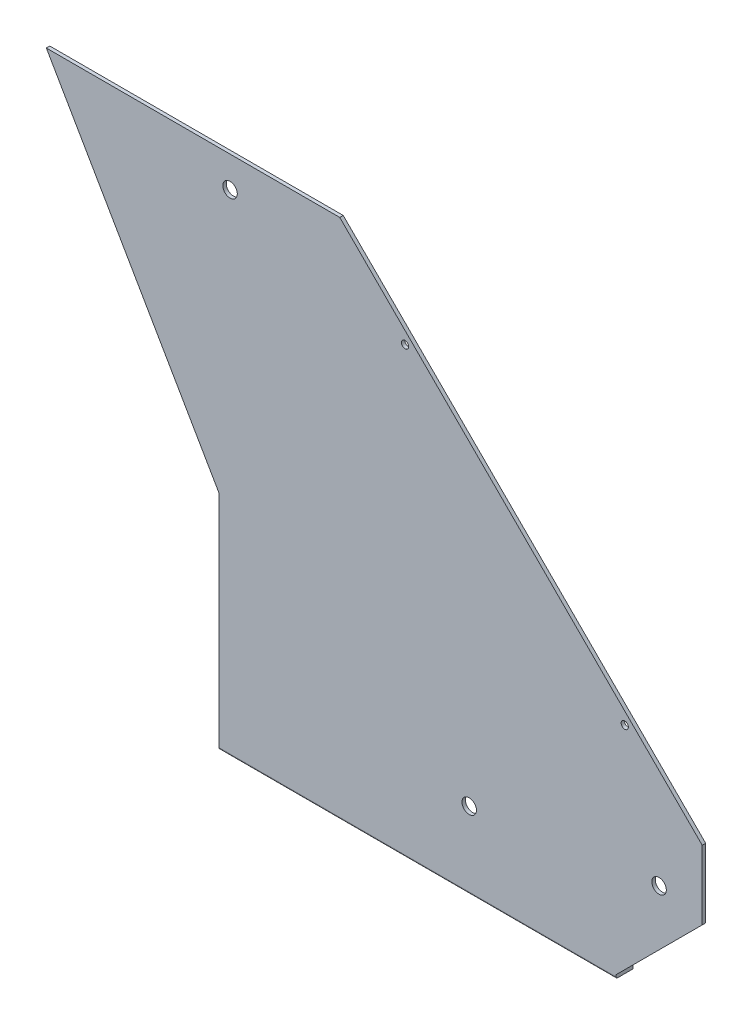
ISO-10303-21;
HEADER;
FILE_DESCRIPTION(('STEP AP214'),'2;1');
FILE_NAME('part.step','',(''),(''),'','','');
FILE_SCHEMA(('AUTOMOTIVE_DESIGN { 1 0 10303 214 1 1 1 1 }'));
ENDSEC;
DATA;
#1=APPLICATION_CONTEXT('core data for automotive mechanical design processes');
#2=APPLICATION_PROTOCOL_DEFINITION('international standard','automotive_design',2000,#1);
#3=PRODUCT_CONTEXT('',#1,'mechanical');
#4=PRODUCT('Part','Part','',(#3));
#5=PRODUCT_RELATED_PRODUCT_CATEGORY('part','',(#4));
#6=PRODUCT_DEFINITION_FORMATION('','',#4);
#7=PRODUCT_DEFINITION_CONTEXT('part definition',#1,'design');
#8=PRODUCT_DEFINITION('design','',#6,#7);
#9=PRODUCT_DEFINITION_SHAPE('','',#8);
#10=(LENGTH_UNIT() NAMED_UNIT(*) SI_UNIT(.MILLI.,.METRE.));
#11=(NAMED_UNIT(*) PLANE_ANGLE_UNIT() SI_UNIT($,.RADIAN.));
#12=(NAMED_UNIT(*) SI_UNIT($,.STERADIAN.) SOLID_ANGLE_UNIT());
#13=UNCERTAINTY_MEASURE_WITH_UNIT(LENGTH_MEASURE(1.E-05),#10,'distance_accuracy_value','');
#14=(GEOMETRIC_REPRESENTATION_CONTEXT(3) GLOBAL_UNCERTAINTY_ASSIGNED_CONTEXT((#13)) GLOBAL_UNIT_ASSIGNED_CONTEXT((#10,
#11,#12)) REPRESENTATION_CONTEXT('',''));
#15=CARTESIAN_POINT('',(0.,0.,0.));
#16=DIRECTION('',(0.,0.,1.));
#17=DIRECTION('',(1.,0.,0.));
#18=AXIS2_PLACEMENT_3D('',#15,#16,#17);
#19=CARTESIAN_POINT('',(0.,150.,-122.));
#20=DIRECTION('',(0.,-1.,0.));
#21=DIRECTION('',(0.,0.,1.));
#22=AXIS2_PLACEMENT_3D('',#19,#20,#21);
#23=PLANE('',#22);
#24=DIRECTION('',(-1.,0.,0.));
#25=VECTOR('',#24,1.);
#26=CARTESIAN_POINT('',(0.,150.,-120.));
#27=LINE('',#26,#25);
#28=CARTESIAN_POINT('',(-70.,150.,-120.));
#29=VERTEX_POINT('',#28);
#30=CARTESIAN_POINT('',(-240.,150.,-120.));
#31=VERTEX_POINT('',#30);
#32=EDGE_CURVE('E175',#29,#31,#27,.T.);
#33=ORIENTED_EDGE('',*,*,#32,.F.);
#34=DIRECTION('',(0.,0.,1.));
#35=VECTOR('',#34,1.);
#36=CARTESIAN_POINT('',(-70.,150.,-122.));
#37=LINE('',#36,#35);
#38=CARTESIAN_POINT('',(-70.,150.,-122.));
#39=VERTEX_POINT('',#38);
#40=EDGE_CURVE('E174',#39,#29,#37,.T.);
#41=ORIENTED_EDGE('',*,*,#40,.F.);
#42=DIRECTION('',(-1.,0.,0.));
#43=VECTOR('',#42,1.);
#44=CARTESIAN_POINT('',(0.,150.,-122.));
#45=LINE('',#44,#43);
#46=CARTESIAN_POINT('',(-240.,150.,-122.));
#47=VERTEX_POINT('',#46);
#48=EDGE_CURVE('E161',#39,#47,#45,.T.);
#49=ORIENTED_EDGE('',*,*,#48,.T.);
#50=DIRECTION('',(0.,0.,1.));
#51=VECTOR('',#50,1.);
#52=CARTESIAN_POINT('',(-240.,150.,-122.));
#53=LINE('',#52,#51);
#54=EDGE_CURVE('E202',#47,#31,#53,.T.);
#55=ORIENTED_EDGE('',*,*,#54,.T.);
#56=EDGE_LOOP('',(#33,#41,#49,#55));
#57=FACE_BOUND('',#56,.T.);
#58=ADVANCED_FACE('F37',(#57),#23,.F.);
#59=CARTESIAN_POINT('',(-115.048094716168,-66.4230484541327,-122.));
#60=DIRECTION('',(0.86602540378444,0.499999999999998,0.));
#61=DIRECTION('',(-0.499999999999998,0.86602540378444,0.));
#62=AXIS2_PLACEMENT_3D('',#59,#60,#61);
#63=PLANE('',#62);
#64=DIRECTION('',(0.499999999999998,-0.86602540378444,0.));
#65=VECTOR('',#64,1.);
#66=CARTESIAN_POINT('',(-115.048094716168,-66.4230484541327,-120.));
#67=LINE('',#66,#65);
#68=CARTESIAN_POINT('',(-140.,-23.2050807568887,-120.));
#69=VERTEX_POINT('',#68);
#70=EDGE_CURVE('E178',#31,#69,#67,.T.);
#71=ORIENTED_EDGE('',*,*,#70,.F.);
#72=ORIENTED_EDGE('',*,*,#54,.F.);
#73=DIRECTION('',(0.499999999999998,-0.86602540378444,0.));
#74=VECTOR('',#73,1.);
#75=CARTESIAN_POINT('',(-115.048094716168,-66.4230484541327,-122.));
#76=LINE('',#75,#74);
#77=CARTESIAN_POINT('',(-140.,-23.2050807568887,-122.));
#78=VERTEX_POINT('',#77);
#79=EDGE_CURVE('E164',#47,#78,#76,.T.);
#80=ORIENTED_EDGE('',*,*,#79,.T.);
#81=DIRECTION('',(0.,0.,1.));
#82=VECTOR('',#81,1.);
#83=CARTESIAN_POINT('',(-140.,-23.2050807568887,-122.));
#84=LINE('',#83,#82);
#85=EDGE_CURVE('E199',#78,#69,#84,.T.);
#86=ORIENTED_EDGE('',*,*,#85,.T.);
#87=EDGE_LOOP('',(#71,#72,#80,#86));
#88=FACE_BOUND('',#87,.T.);
#89=ADVANCED_FACE('F254',(#88),#63,.F.);
#90=CARTESIAN_POINT('',(-140.,0.,-122.));
#91=DIRECTION('',(1.,0.,0.));
#92=DIRECTION('',(0.,1.,0.));
#93=AXIS2_PLACEMENT_3D('',#90,#91,#92);
#94=PLANE('',#93);
#95=DIRECTION('',(0.,-1.,0.));
#96=VECTOR('',#95,1.);
#97=CARTESIAN_POINT('',(-140.,0.,-120.));
#98=LINE('',#97,#96);
#99=CARTESIAN_POINT('',(-140.,-151.,-120.));
#100=VERTEX_POINT('',#99);
#101=EDGE_CURVE('E181',#69,#100,#98,.T.);
#102=ORIENTED_EDGE('',*,*,#101,.F.);
#103=ORIENTED_EDGE('',*,*,#85,.F.);
#104=DIRECTION('',(0.,-1.,0.));
#105=VECTOR('',#104,1.);
#106=CARTESIAN_POINT('',(-140.,0.,-122.));
#107=LINE('',#106,#105);
#108=CARTESIAN_POINT('',(-140.,-149.,-122.));
#109=VERTEX_POINT('',#108);
#110=EDGE_CURVE('E168',#78,#109,#107,.T.);
#111=ORIENTED_EDGE('',*,*,#110,.T.);
#112=CARTESIAN_POINT('',(-140.,-149.,-123.));
#113=DIRECTION('',(-1.,0.,0.));
#114=DIRECTION('',(0.,1.,0.));
#115=AXIS2_PLACEMENT_3D('',#112,#113,#114);
#116=CIRCLE('',#115,1.);
#117=CARTESIAN_POINT('',(-140.,-150.,-123.));
#118=VERTEX_POINT('',#117);
#119=EDGE_CURVE('E11',#118,#109,#116,.T.);
#120=ORIENTED_EDGE('',*,*,#119,.F.);
#121=DIRECTION('',(0.,0.,1.));
#122=VECTOR('',#121,1.);
#123=CARTESIAN_POINT('',(-140.,-150.,-120.));
#124=LINE('',#123,#122);
#125=CARTESIAN_POINT('',(-140.,-150.,-130.));
#126=VERTEX_POINT('',#125);
#127=EDGE_CURVE('E156',#126,#118,#124,.T.);
#128=ORIENTED_EDGE('',*,*,#127,.F.);
#129=DIRECTION('',(0.,1.,0.));
#130=VECTOR('',#129,1.);
#131=CARTESIAN_POINT('',(-140.,-152.,-130.));
#132=LINE('',#131,#130);
#133=CARTESIAN_POINT('',(-140.,-152.,-130.));
#134=VERTEX_POINT('',#133);
#135=EDGE_CURVE('E134',#134,#126,#132,.T.);
#136=ORIENTED_EDGE('',*,*,#135,.F.);
#137=DIRECTION('',(0.,0.,1.));
#138=VECTOR('',#137,1.);
#139=CARTESIAN_POINT('',(-140.,-152.,-120.));
#140=LINE('',#139,#138);
#141=CARTESIAN_POINT('',(-140.,-152.,-121.));
#142=VERTEX_POINT('',#141);
#143=EDGE_CURVE('E130',#134,#142,#140,.T.);
#144=ORIENTED_EDGE('',*,*,#143,.T.);
#145=CARTESIAN_POINT('',(-140.,-151.,-121.));
#146=DIRECTION('',(-1.,0.,0.));
#147=DIRECTION('',(0.,1.,0.));
#148=AXIS2_PLACEMENT_3D('',#145,#146,#147);
#149=CIRCLE('',#148,1.);
#150=EDGE_CURVE('E222',#100,#142,#149,.F.);
#151=ORIENTED_EDGE('',*,*,#150,.F.);
#152=EDGE_LOOP('',(#102,#103,#111,#120,#128,#136,#144,#151));
#153=FACE_BOUND('',#152,.T.);
#154=ADVANCED_FACE('F237',(#153),#94,.F.);
#155=CARTESIAN_POINT('',(120.,-120.,-122.));
#156=DIRECTION('',(0.707106781186547,-0.707106781186547,0.));
#157=DIRECTION('',(0.707106781186548,0.707106781186548,0.));
#158=AXIS2_PLACEMENT_3D('',#155,#156,#157);
#159=PLANE('',#158);
#160=DIRECTION('',(-0.707106781186548,-0.707106781186548,0.));
#161=VECTOR('',#160,1.);
#162=CARTESIAN_POINT('',(120.,-120.,-120.));
#163=LINE('',#162,#161);
#164=CARTESIAN_POINT('',(140.,-100.,-120.));
#165=VERTEX_POINT('',#164);
#166=CARTESIAN_POINT('',(90.0000000000001,-150.,-120.));
#167=VERTEX_POINT('',#166);
#168=EDGE_CURVE('E184',#165,#167,#163,.T.);
#169=ORIENTED_EDGE('',*,*,#168,.T.);
#170=DIRECTION('',(0.,0.,1.));
#171=VECTOR('',#170,1.);
#172=CARTESIAN_POINT('',(90.0000000000001,-150.,-122.));
#173=LINE('',#172,#171);
#174=CARTESIAN_POINT('',(90.0000000000001,-150.,-123.));
#175=VERTEX_POINT('',#174);
#176=EDGE_CURVE('E198',#175,#167,#173,.T.);
#177=ORIENTED_EDGE('',*,*,#176,.F.);
#178=CARTESIAN_POINT('',(91.0000000000001,-149.,-123.));
#179=DIRECTION('',(-0.707106781186547,0.707106781186547,0.));
#180=DIRECTION('',(-0.707106781186548,-0.707106781186548,0.));
#181=AXIS2_PLACEMENT_3D('',#178,#179,#180);
#182=ELLIPSE('',#181,1.4142135623731,1.);
#183=CARTESIAN_POINT('',(91.0000000000001,-149.,-122.));
#184=VERTEX_POINT('',#183);
#185=EDGE_CURVE('E45',#184,#175,#182,.F.);
#186=ORIENTED_EDGE('',*,*,#185,.F.);
#187=DIRECTION('',(-0.707106781186548,-0.707106781186548,0.));
#188=VECTOR('',#187,1.);
#189=CARTESIAN_POINT('',(120.,-120.,-122.));
#190=LINE('',#189,#188);
#191=CARTESIAN_POINT('',(140.,-100.,-122.));
#192=VERTEX_POINT('',#191);
#193=EDGE_CURVE('E172',#192,#184,#190,.T.);
#194=ORIENTED_EDGE('',*,*,#193,.F.);
#195=DIRECTION('',(0.,0.,1.));
#196=VECTOR('',#195,1.);
#197=CARTESIAN_POINT('',(140.,-100.,-122.));
#198=LINE('',#197,#196);
#199=EDGE_CURVE('E195',#192,#165,#198,.T.);
#200=ORIENTED_EDGE('',*,*,#199,.T.);
#201=EDGE_LOOP('',(#169,#177,#186,#194,#200));
#202=FACE_BOUND('',#201,.T.);
#203=ADVANCED_FACE('F230',(#202),#159,.T.);
#204=CARTESIAN_POINT('',(140.,0.,-122.));
#205=DIRECTION('',(1.,0.,0.));
#206=DIRECTION('',(0.,1.,0.));
#207=AXIS2_PLACEMENT_3D('',#204,#205,#206);
#208=PLANE('',#207);
#209=DIRECTION('',(0.,-1.,0.));
#210=VECTOR('',#209,1.);
#211=CARTESIAN_POINT('',(140.,0.,-120.));
#212=LINE('',#211,#210);
#213=CARTESIAN_POINT('',(140.,-60.0000000000008,-120.));
#214=VERTEX_POINT('',#213);
#215=EDGE_CURVE('E187',#214,#165,#212,.T.);
#216=ORIENTED_EDGE('',*,*,#215,.T.);
#217=ORIENTED_EDGE('',*,*,#199,.F.);
#218=DIRECTION('',(0.,-1.,0.));
#219=VECTOR('',#218,1.);
#220=CARTESIAN_POINT('',(140.,0.,-122.));
#221=LINE('',#220,#219);
#222=CARTESIAN_POINT('',(140.,-60.0000000000008,-122.));
#223=VERTEX_POINT('',#222);
#224=EDGE_CURVE('E169',#223,#192,#221,.T.);
#225=ORIENTED_EDGE('',*,*,#224,.F.);
#226=DIRECTION('',(0.,0.,1.));
#227=VECTOR('',#226,1.);
#228=CARTESIAN_POINT('',(140.,-60.0000000000008,-122.));
#229=LINE('',#228,#227);
#230=EDGE_CURVE('E192',#223,#214,#229,.T.);
#231=ORIENTED_EDGE('',*,*,#230,.T.);
#232=EDGE_LOOP('',(#216,#217,#225,#231));
#233=FACE_BOUND('',#232,.T.);
#234=ADVANCED_FACE('F261',(#233),#208,.T.);
#235=CARTESIAN_POINT('',(39.9999999999999,39.9999999999998,-122.));
#236=DIRECTION('',(0.707106781186549,0.707106781186546,0.));
#237=DIRECTION('',(-0.707106781186546,0.707106781186549,0.));
#238=AXIS2_PLACEMENT_3D('',#235,#236,#237);
#239=PLANE('',#238);
#240=DIRECTION('',(0.707106781186546,-0.707106781186549,0.));
#241=VECTOR('',#240,1.);
#242=CARTESIAN_POINT('',(39.9999999999999,39.9999999999998,-120.));
#243=LINE('',#242,#241);
#244=EDGE_CURVE('E165',#29,#214,#243,.T.);
#245=ORIENTED_EDGE('',*,*,#244,.T.);
#246=ORIENTED_EDGE('',*,*,#230,.F.);
#247=DIRECTION('',(0.707106781186546,-0.707106781186549,0.));
#248=VECTOR('',#247,1.);
#249=CARTESIAN_POINT('',(39.9999999999999,39.9999999999998,-122.));
#250=LINE('',#249,#248);
#251=EDGE_CURVE('E171',#39,#223,#250,.T.);
#252=ORIENTED_EDGE('',*,*,#251,.F.);
#253=ORIENTED_EDGE('',*,*,#40,.T.);
#254=EDGE_LOOP('',(#245,#246,#252,#253));
#255=FACE_BOUND('',#254,.T.);
#256=ADVANCED_FACE('F260',(#255),#239,.T.);
#257=CARTESIAN_POINT('',(0.,0.,-122.));
#258=DIRECTION('',(0.,0.,-1.));
#259=DIRECTION('',(1.,0.,0.));
#260=AXIS2_PLACEMENT_3D('',#257,#258,#259);
#261=PLANE('',#260);
#262=CARTESIAN_POINT('',(-32.1751442127218,105.104076400856,-122.));
#263=DIRECTION('',(0.,0.,1.));
#264=DIRECTION('',(1.,0.,0.));
#265=AXIS2_PLACEMENT_3D('',#262,#263,#264);
#266=CIRCLE('',#265,2.1);
#267=CARTESIAN_POINT('',(-30.0751442127218,105.104076400856,-122.));
#268=VERTEX_POINT('',#267);
#269=EDGE_CURVE('E353',#268,#268,#266,.T.);
#270=ORIENTED_EDGE('',*,*,#269,.T.);
#271=EDGE_LOOP('',(#270));
#272=FACE_BOUND('',#271,.T.);
#273=CARTESIAN_POINT('',(95.1040764008565,-22.1751442127225,-122.));
#274=DIRECTION('',(0.,0.,1.));
#275=DIRECTION('',(1.,0.,0.));
#276=AXIS2_PLACEMENT_3D('',#273,#274,#275);
#277=CIRCLE('',#276,2.1);
#278=CARTESIAN_POINT('',(97.2040764008565,-22.1751442127225,-122.));
#279=VERTEX_POINT('',#278);
#280=EDGE_CURVE('E349',#279,#279,#277,.T.);
#281=ORIENTED_EDGE('',*,*,#280,.T.);
#282=EDGE_LOOP('',(#281));
#283=FACE_BOUND('',#282,.T.);
#284=CARTESIAN_POINT('',(115.,-92.89246887,-122.));
#285=DIRECTION('',(0.,0.,1.));
#286=DIRECTION('',(1.,0.,0.));
#287=AXIS2_PLACEMENT_3D('',#284,#285,#286);
#288=CIRCLE('',#287,4.19999999999999);
#289=CARTESIAN_POINT('',(119.2,-92.89246887,-122.));
#290=VERTEX_POINT('',#289);
#291=EDGE_CURVE('E333',#290,#290,#288,.T.);
#292=ORIENTED_EDGE('',*,*,#291,.T.);
#293=EDGE_LOOP('',(#292));
#294=FACE_BOUND('',#293,.T.);
#295=CARTESIAN_POINT('',(4.99999999999995,-107.89246887,-122.));
#296=DIRECTION('',(0.,0.,1.));
#297=DIRECTION('',(1.,0.,0.));
#298=AXIS2_PLACEMENT_3D('',#295,#296,#297);
#299=CIRCLE('',#298,4.2);
#300=CARTESIAN_POINT('',(9.19999999999995,-107.89246887,-122.));
#301=VERTEX_POINT('',#300);
#302=EDGE_CURVE('E329',#301,#301,#299,.T.);
#303=ORIENTED_EDGE('',*,*,#302,.T.);
#304=EDGE_LOOP('',(#303));
#305=FACE_BOUND('',#304,.T.);
#306=CARTESIAN_POINT('',(-133.564064605509,132.10753113,-122.));
#307=DIRECTION('',(0.,0.,1.));
#308=DIRECTION('',(1.,0.,0.));
#309=AXIS2_PLACEMENT_3D('',#306,#307,#308);
#310=CIRCLE('',#309,4.20000000000001);
#311=CARTESIAN_POINT('',(-129.364064605509,132.10753113,-122.));
#312=VERTEX_POINT('',#311);
#313=EDGE_CURVE('E325',#312,#312,#310,.T.);
#314=ORIENTED_EDGE('',*,*,#313,.T.);
#315=EDGE_LOOP('',(#314));
#316=FACE_BOUND('',#315,.T.);
#317=ORIENTED_EDGE('',*,*,#110,.F.);
#318=ORIENTED_EDGE('',*,*,#79,.F.);
#319=ORIENTED_EDGE('',*,*,#48,.F.);
#320=ORIENTED_EDGE('',*,*,#251,.T.);
#321=ORIENTED_EDGE('',*,*,#224,.T.);
#322=ORIENTED_EDGE('',*,*,#193,.T.);
#323=DIRECTION('',(1.,0.,0.));
#324=VECTOR('',#323,1.);
#325=CARTESIAN_POINT('',(90.0000000000001,-149.,-122.));
#326=LINE('',#325,#324);
#327=EDGE_CURVE('E59',#109,#184,#326,.T.);
#328=ORIENTED_EDGE('',*,*,#327,.F.);
#329=EDGE_LOOP('',(#317,#318,#319,#320,#321,#322,#328));
#330=FACE_BOUND('',#329,.T.);
#331=ADVANCED_FACE('F240',(#272,#283,#294,#305,#316,#330),#261,.T.);
#332=CARTESIAN_POINT('',(0.,0.,-120.));
#333=DIRECTION('',(0.,0.,-1.));
#334=DIRECTION('',(1.,0.,0.));
#335=AXIS2_PLACEMENT_3D('',#332,#333,#334);
#336=PLANE('',#335);
#337=CARTESIAN_POINT('',(-32.1751442127218,105.104076400856,-120.));
#338=DIRECTION('',(0.,0.,1.));
#339=DIRECTION('',(1.,0.,0.));
#340=AXIS2_PLACEMENT_3D('',#337,#338,#339);
#341=CIRCLE('',#340,2.1);
#342=CARTESIAN_POINT('',(-30.0751442127218,105.104076400856,-120.));
#343=VERTEX_POINT('',#342);
#344=EDGE_CURVE('E309',#343,#343,#341,.T.);
#345=ORIENTED_EDGE('',*,*,#344,.F.);
#346=EDGE_LOOP('',(#345));
#347=FACE_BOUND('',#346,.T.);
#348=CARTESIAN_POINT('',(95.1040764008565,-22.1751442127225,-120.));
#349=DIRECTION('',(0.,0.,1.));
#350=DIRECTION('',(1.,0.,0.));
#351=AXIS2_PLACEMENT_3D('',#348,#349,#350);
#352=CIRCLE('',#351,2.1);
#353=CARTESIAN_POINT('',(97.2040764008565,-22.1751442127225,-120.));
#354=VERTEX_POINT('',#353);
#355=EDGE_CURVE('E313',#354,#354,#352,.T.);
#356=ORIENTED_EDGE('',*,*,#355,.F.);
#357=EDGE_LOOP('',(#356));
#358=FACE_BOUND('',#357,.T.);
#359=CARTESIAN_POINT('',(115.,-92.89246887,-120.));
#360=DIRECTION('',(0.,0.,1.));
#361=DIRECTION('',(1.,0.,0.));
#362=AXIS2_PLACEMENT_3D('',#359,#360,#361);
#363=CIRCLE('',#362,4.19999999999999);
#364=CARTESIAN_POINT('',(119.2,-92.89246887,-120.));
#365=VERTEX_POINT('',#364);
#366=EDGE_CURVE('E317',#365,#365,#363,.T.);
#367=ORIENTED_EDGE('',*,*,#366,.F.);
#368=EDGE_LOOP('',(#367));
#369=FACE_BOUND('',#368,.T.);
#370=CARTESIAN_POINT('',(4.99999999999995,-107.89246887,-120.));
#371=DIRECTION('',(0.,0.,1.));
#372=DIRECTION('',(1.,0.,0.));
#373=AXIS2_PLACEMENT_3D('',#370,#371,#372);
#374=CIRCLE('',#373,4.2);
#375=CARTESIAN_POINT('',(9.19999999999995,-107.89246887,-120.));
#376=VERTEX_POINT('',#375);
#377=EDGE_CURVE('E321',#376,#376,#374,.T.);
#378=ORIENTED_EDGE('',*,*,#377,.F.);
#379=EDGE_LOOP('',(#378));
#380=FACE_BOUND('',#379,.T.);
#381=CARTESIAN_POINT('',(-133.564064605509,132.10753113,-120.));
#382=DIRECTION('',(0.,0.,1.));
#383=DIRECTION('',(1.,0.,0.));
#384=AXIS2_PLACEMENT_3D('',#381,#382,#383);
#385=CIRCLE('',#384,4.20000000000001);
#386=CARTESIAN_POINT('',(-129.364064605509,132.10753113,-120.));
#387=VERTEX_POINT('',#386);
#388=EDGE_CURVE('E160',#387,#387,#385,.T.);
#389=ORIENTED_EDGE('',*,*,#388,.F.);
#390=EDGE_LOOP('',(#389));
#391=FACE_BOUND('',#390,.T.);
#392=DIRECTION('',(0.,1.,0.));
#393=VECTOR('',#392,1.);
#394=CARTESIAN_POINT('',(90.0000000000001,-152.,-120.));
#395=LINE('',#394,#393);
#396=CARTESIAN_POINT('',(90.0000000000001,-151.,-120.));
#397=VERTEX_POINT('',#396);
#398=EDGE_CURVE('E141',#397,#167,#395,.T.);
#399=ORIENTED_EDGE('',*,*,#398,.T.);
#400=ORIENTED_EDGE('',*,*,#168,.F.);
#401=ORIENTED_EDGE('',*,*,#215,.F.);
#402=ORIENTED_EDGE('',*,*,#244,.F.);
#403=ORIENTED_EDGE('',*,*,#32,.T.);
#404=ORIENTED_EDGE('',*,*,#70,.T.);
#405=ORIENTED_EDGE('',*,*,#101,.T.);
#406=DIRECTION('',(1.,0.,0.));
#407=VECTOR('',#406,1.);
#408=CARTESIAN_POINT('',(0.,-151.,-120.));
#409=LINE('',#408,#407);
#410=EDGE_CURVE('E220',#397,#100,#409,.F.);
#411=ORIENTED_EDGE('',*,*,#410,.F.);
#412=EDGE_LOOP('',(#399,#400,#401,#402,#403,#404,#405,#411));
#413=FACE_BOUND('',#412,.T.);
#414=ADVANCED_FACE('F248',(#347,#358,#369,#380,#391,#413),#336,.F.);
#415=CARTESIAN_POINT('',(0.,-150.,-120.));
#416=DIRECTION('',(0.,1.,0.));
#417=DIRECTION('',(0.,0.,-1.));
#418=AXIS2_PLACEMENT_3D('',#415,#416,#417);
#419=PLANE('',#418);
#420=CARTESIAN_POINT('',(-120.,-150.,-126.));
#421=DIRECTION('',(0.,-1.,0.));
#422=DIRECTION('',(0.,0.,-1.));
#423=AXIS2_PLACEMENT_3D('',#420,#421,#422);
#424=CIRCLE('',#423,2.1);
#425=CARTESIAN_POINT('',(-120.,-150.,-128.1));
#426=VERTEX_POINT('',#425);
#427=EDGE_CURVE('E344',#426,#426,#424,.T.);
#428=ORIENTED_EDGE('',*,*,#427,.T.);
#429=EDGE_LOOP('',(#428));
#430=FACE_BOUND('',#429,.T.);
#431=CARTESIAN_POINT('',(10.0000000000001,-150.,-126.));
#432=DIRECTION('',(0.,-1.,0.));
#433=DIRECTION('',(0.,0.,-1.));
#434=AXIS2_PLACEMENT_3D('',#431,#432,#433);
#435=CIRCLE('',#434,2.1);
#436=CARTESIAN_POINT('',(10.0000000000001,-150.,-128.1));
#437=VERTEX_POINT('',#436);
#438=EDGE_CURVE('E338',#437,#437,#435,.T.);
#439=ORIENTED_EDGE('',*,*,#438,.T.);
#440=EDGE_LOOP('',(#439));
#441=FACE_BOUND('',#440,.T.);
#442=DIRECTION('',(0.,0.,-1.));
#443=VECTOR('',#442,1.);
#444=CARTESIAN_POINT('',(90.0000000000001,-150.,-120.));
#445=LINE('',#444,#443);
#446=CARTESIAN_POINT('',(90.0000000000001,-150.,-130.));
#447=VERTEX_POINT('',#446);
#448=EDGE_CURVE('E159',#175,#447,#445,.T.);
#449=ORIENTED_EDGE('',*,*,#448,.T.);
#450=DIRECTION('',(-1.,0.,0.));
#451=VECTOR('',#450,1.);
#452=CARTESIAN_POINT('',(-140.,-150.,-130.));
#453=LINE('',#452,#451);
#454=EDGE_CURVE('E139',#447,#126,#453,.T.);
#455=ORIENTED_EDGE('',*,*,#454,.T.);
#456=ORIENTED_EDGE('',*,*,#127,.T.);
#457=DIRECTION('',(1.,0.,0.));
#458=VECTOR('',#457,1.);
#459=CARTESIAN_POINT('',(-140.,-150.,-123.));
#460=LINE('',#459,#458);
#461=EDGE_CURVE('E52',#175,#118,#460,.F.);
#462=ORIENTED_EDGE('',*,*,#461,.F.);
#463=EDGE_LOOP('',(#449,#455,#456,#462));
#464=FACE_BOUND('',#463,.T.);
#465=ADVANCED_FACE('F232',(#430,#441,#464),#419,.T.);
#466=CARTESIAN_POINT('',(90.0000000000001,-152.,-120.));
#467=DIRECTION('',(-1.,0.,0.));
#468=DIRECTION('',(0.,0.,-1.));
#469=AXIS2_PLACEMENT_3D('',#466,#467,#468);
#470=PLANE('',#469);
#471=DIRECTION('',(0.,0.,-1.));
#472=VECTOR('',#471,1.);
#473=CARTESIAN_POINT('',(90.0000000000001,-152.,-120.));
#474=LINE('',#473,#472);
#475=CARTESIAN_POINT('',(90.0000000000001,-152.,-121.));
#476=VERTEX_POINT('',#475);
#477=CARTESIAN_POINT('',(90.0000000000001,-152.,-130.));
#478=VERTEX_POINT('',#477);
#479=EDGE_CURVE('E128',#476,#478,#474,.T.);
#480=ORIENTED_EDGE('',*,*,#479,.T.);
#481=DIRECTION('',(0.,1.,0.));
#482=VECTOR('',#481,1.);
#483=CARTESIAN_POINT('',(90.0000000000001,-152.,-130.));
#484=LINE('',#483,#482);
#485=EDGE_CURVE('E137',#478,#447,#484,.T.);
#486=ORIENTED_EDGE('',*,*,#485,.T.);
#487=ORIENTED_EDGE('',*,*,#448,.F.);
#488=ORIENTED_EDGE('',*,*,#176,.T.);
#489=ORIENTED_EDGE('',*,*,#398,.F.);
#490=CARTESIAN_POINT('',(90.0000000000001,-151.,-121.));
#491=DIRECTION('',(1.,0.,0.));
#492=DIRECTION('',(0.,0.,-1.));
#493=AXIS2_PLACEMENT_3D('',#490,#491,#492);
#494=CIRCLE('',#493,1.);
#495=EDGE_CURVE('E146',#476,#397,#494,.F.);
#496=ORIENTED_EDGE('',*,*,#495,.F.);
#497=EDGE_LOOP('',(#480,#486,#487,#488,#489,#496));
#498=FACE_BOUND('',#497,.T.);
#499=ADVANCED_FACE('F144',(#498),#470,.F.);
#500=CARTESIAN_POINT('',(-140.,-152.,-130.));
#501=DIRECTION('',(0.,0.,1.));
#502=DIRECTION('',(-1.,0.,0.));
#503=AXIS2_PLACEMENT_3D('',#500,#501,#502);
#504=PLANE('',#503);
#505=ORIENTED_EDGE('',*,*,#454,.F.);
#506=ORIENTED_EDGE('',*,*,#485,.F.);
#507=DIRECTION('',(-1.,0.,0.));
#508=VECTOR('',#507,1.);
#509=CARTESIAN_POINT('',(-140.,-152.,-130.));
#510=LINE('',#509,#508);
#511=EDGE_CURVE('E124',#478,#134,#510,.T.);
#512=ORIENTED_EDGE('',*,*,#511,.T.);
#513=ORIENTED_EDGE('',*,*,#135,.T.);
#514=EDGE_LOOP('',(#505,#506,#512,#513));
#515=FACE_BOUND('',#514,.T.);
#516=ADVANCED_FACE('F138',(#515),#504,.F.);
#517=CARTESIAN_POINT('',(0.,-152.,-120.));
#518=DIRECTION('',(0.,1.,0.));
#519=DIRECTION('',(0.,0.,-1.));
#520=AXIS2_PLACEMENT_3D('',#517,#518,#519);
#521=PLANE('',#520);
#522=CARTESIAN_POINT('',(-120.,-152.,-126.));
#523=DIRECTION('',(0.,-1.,0.));
#524=DIRECTION('',(0.,0.,-1.));
#525=AXIS2_PLACEMENT_3D('',#522,#523,#524);
#526=CIRCLE('',#525,2.1);
#527=CARTESIAN_POINT('',(-120.,-152.,-128.1));
#528=VERTEX_POINT('',#527);
#529=EDGE_CURVE('E341',#528,#528,#526,.T.);
#530=ORIENTED_EDGE('',*,*,#529,.F.);
#531=EDGE_LOOP('',(#530));
#532=FACE_BOUND('',#531,.T.);
#533=CARTESIAN_POINT('',(10.0000000000001,-152.,-126.));
#534=DIRECTION('',(0.,-1.,0.));
#535=DIRECTION('',(0.,0.,-1.));
#536=AXIS2_PLACEMENT_3D('',#533,#534,#535);
#537=CIRCLE('',#536,2.1);
#538=CARTESIAN_POINT('',(10.0000000000001,-152.,-128.1));
#539=VERTEX_POINT('',#538);
#540=EDGE_CURVE('E336',#539,#539,#537,.T.);
#541=ORIENTED_EDGE('',*,*,#540,.F.);
#542=EDGE_LOOP('',(#541));
#543=FACE_BOUND('',#542,.T.);
#544=ORIENTED_EDGE('',*,*,#143,.F.);
#545=ORIENTED_EDGE('',*,*,#511,.F.);
#546=ORIENTED_EDGE('',*,*,#479,.F.);
#547=DIRECTION('',(1.,0.,0.));
#548=VECTOR('',#547,1.);
#549=CARTESIAN_POINT('',(0.,-152.,-121.));
#550=LINE('',#549,#548);
#551=EDGE_CURVE('E205',#142,#476,#550,.T.);
#552=ORIENTED_EDGE('',*,*,#551,.F.);
#553=EDGE_LOOP('',(#544,#545,#546,#552));
#554=FACE_BOUND('',#553,.T.);
#555=ADVANCED_FACE('F126',(#532,#543,#554),#521,.F.);
#556=CARTESIAN_POINT('',(0.,-151.,-121.));
#557=DIRECTION('',(1.,0.,0.));
#558=DIRECTION('',(0.,0.,1.));
#559=AXIS2_PLACEMENT_3D('',#556,#557,#558);
#560=CYLINDRICAL_SURFACE('',#559,1.);
#561=ORIENTED_EDGE('',*,*,#150,.T.);
#562=ORIENTED_EDGE('',*,*,#551,.T.);
#563=ORIENTED_EDGE('',*,*,#495,.T.);
#564=ORIENTED_EDGE('',*,*,#410,.T.);
#565=EDGE_LOOP('',(#561,#562,#563,#564));
#566=FACE_BOUND('',#565,.T.);
#567=ADVANCED_FACE('F252',(#566),#560,.T.);
#568=CARTESIAN_POINT('',(0.,-149.,-123.));
#569=DIRECTION('',(-1.,0.,0.));
#570=DIRECTION('',(0.,0.,-1.));
#571=AXIS2_PLACEMENT_3D('',#568,#569,#570);
#572=CYLINDRICAL_SURFACE('',#571,1.);
#573=ORIENTED_EDGE('',*,*,#119,.T.);
#574=ORIENTED_EDGE('',*,*,#327,.T.);
#575=ORIENTED_EDGE('',*,*,#185,.T.);
#576=ORIENTED_EDGE('',*,*,#461,.T.);
#577=EDGE_LOOP('',(#573,#574,#575,#576));
#578=FACE_BOUND('',#577,.T.);
#579=ADVANCED_FACE('F39',(#578),#572,.F.);
#580=CARTESIAN_POINT('',(-133.564064605509,132.10753113,-120.));
#581=DIRECTION('',(0.,0.,-1.));
#582=DIRECTION('',(1.,0.,0.));
#583=AXIS2_PLACEMENT_3D('',#580,#581,#582);
#584=CYLINDRICAL_SURFACE('',#583,4.20000000000001);
#585=ORIENTED_EDGE('',*,*,#388,.T.);
#586=EDGE_LOOP('',(#585));
#587=FACE_BOUND('',#586,.T.);
#588=ORIENTED_EDGE('',*,*,#313,.F.);
#589=EDGE_LOOP('',(#588));
#590=FACE_BOUND('',#589,.T.);
#591=ADVANCED_FACE('F282',(#587,#590),#584,.F.);
#592=CARTESIAN_POINT('',(4.99999999999995,-107.89246887,-120.));
#593=DIRECTION('',(0.,0.,-1.));
#594=DIRECTION('',(1.,0.,0.));
#595=AXIS2_PLACEMENT_3D('',#592,#593,#594);
#596=CYLINDRICAL_SURFACE('',#595,4.2);
#597=ORIENTED_EDGE('',*,*,#377,.T.);
#598=EDGE_LOOP('',(#597));
#599=FACE_BOUND('',#598,.T.);
#600=ORIENTED_EDGE('',*,*,#302,.F.);
#601=EDGE_LOOP('',(#600));
#602=FACE_BOUND('',#601,.T.);
#603=ADVANCED_FACE('F373',(#599,#602),#596,.F.);
#604=CARTESIAN_POINT('',(115.,-92.89246887,-120.));
#605=DIRECTION('',(0.,0.,-1.));
#606=DIRECTION('',(1.,0.,0.));
#607=AXIS2_PLACEMENT_3D('',#604,#605,#606);
#608=CYLINDRICAL_SURFACE('',#607,4.19999999999999);
#609=ORIENTED_EDGE('',*,*,#366,.T.);
#610=EDGE_LOOP('',(#609));
#611=FACE_BOUND('',#610,.T.);
#612=ORIENTED_EDGE('',*,*,#291,.F.);
#613=EDGE_LOOP('',(#612));
#614=FACE_BOUND('',#613,.T.);
#615=ADVANCED_FACE('F377',(#611,#614),#608,.F.);
#616=CARTESIAN_POINT('',(10.0000000000001,-152.,-126.));
#617=DIRECTION('',(0.,1.,0.));
#618=DIRECTION('',(0.,0.,-1.));
#619=AXIS2_PLACEMENT_3D('',#616,#617,#618);
#620=CYLINDRICAL_SURFACE('',#619,2.1);
#621=ORIENTED_EDGE('',*,*,#540,.T.);
#622=EDGE_LOOP('',(#621));
#623=FACE_BOUND('',#622,.T.);
#624=ORIENTED_EDGE('',*,*,#438,.F.);
#625=EDGE_LOOP('',(#624));
#626=FACE_BOUND('',#625,.T.);
#627=ADVANCED_FACE('F382',(#623,#626),#620,.F.);
#628=CARTESIAN_POINT('',(-120.,-152.,-126.));
#629=DIRECTION('',(0.,1.,0.));
#630=DIRECTION('',(0.,0.,-1.));
#631=AXIS2_PLACEMENT_3D('',#628,#629,#630);
#632=CYLINDRICAL_SURFACE('',#631,2.1);
#633=ORIENTED_EDGE('',*,*,#529,.T.);
#634=EDGE_LOOP('',(#633));
#635=FACE_BOUND('',#634,.T.);
#636=ORIENTED_EDGE('',*,*,#427,.F.);
#637=EDGE_LOOP('',(#636));
#638=FACE_BOUND('',#637,.T.);
#639=ADVANCED_FACE('F389',(#635,#638),#632,.F.);
#640=CARTESIAN_POINT('',(95.1040764008565,-22.1751442127225,-120.));
#641=DIRECTION('',(0.,0.,-1.));
#642=DIRECTION('',(1.,0.,0.));
#643=AXIS2_PLACEMENT_3D('',#640,#641,#642);
#644=CYLINDRICAL_SURFACE('',#643,2.1);
#645=ORIENTED_EDGE('',*,*,#355,.T.);
#646=EDGE_LOOP('',(#645));
#647=FACE_BOUND('',#646,.T.);
#648=ORIENTED_EDGE('',*,*,#280,.F.);
#649=EDGE_LOOP('',(#648));
#650=FACE_BOUND('',#649,.T.);
#651=ADVANCED_FACE('F360',(#647,#650),#644,.F.);
#652=CARTESIAN_POINT('',(-32.1751442127218,105.104076400856,-120.));
#653=DIRECTION('',(0.,0.,-1.));
#654=DIRECTION('',(1.,0.,0.));
#655=AXIS2_PLACEMENT_3D('',#652,#653,#654);
#656=CYLINDRICAL_SURFACE('',#655,2.1);
#657=ORIENTED_EDGE('',*,*,#344,.T.);
#658=EDGE_LOOP('',(#657));
#659=FACE_BOUND('',#658,.T.);
#660=ORIENTED_EDGE('',*,*,#269,.F.);
#661=EDGE_LOOP('',(#660));
#662=FACE_BOUND('',#661,.T.);
#663=ADVANCED_FACE('F357',(#659,#662),#656,.F.);
#664=CLOSED_SHELL('',(#58,#89,#154,#203,#234,#256,#331,#414,#465,#499,#516,#555,#567,#579,#591,
#603,#615,#627,#639,#651,#663));
#665=MANIFOLD_SOLID_BREP('B2',#664);
#666=ADVANCED_BREP_SHAPE_REPRESENTATION('',(#18,#665),#14);
#667=SHAPE_DEFINITION_REPRESENTATION(#9,#666);
ENDSEC;
END-ISO-10303-21;
